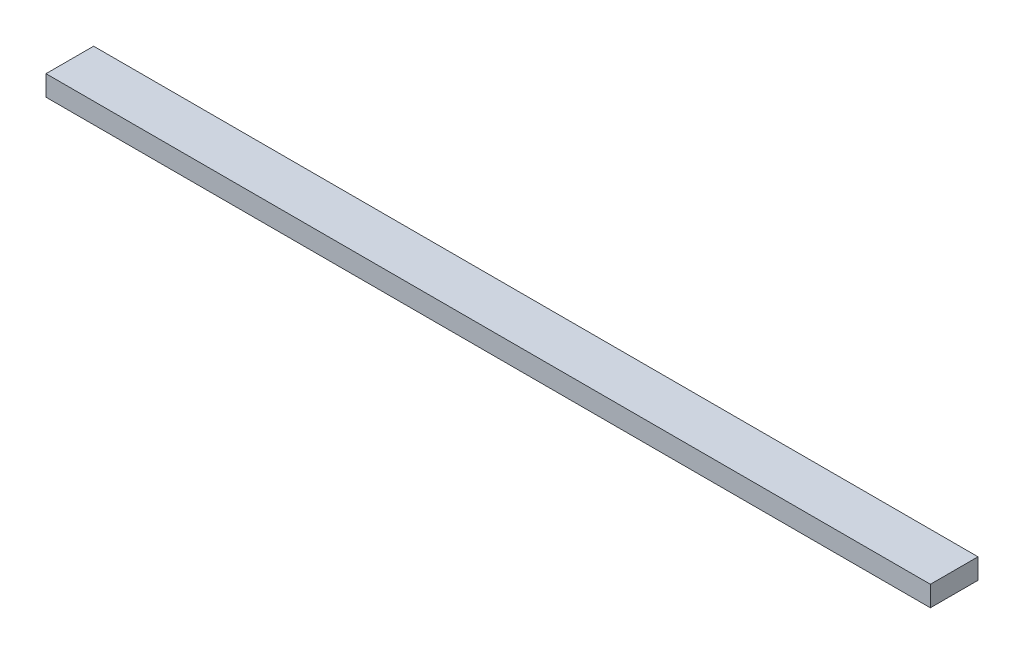
ISO-10303-21;
HEADER;
FILE_DESCRIPTION(('STEP AP214'),'2;1');
FILE_NAME('part.step','',(''),(''),'','','');
FILE_SCHEMA(('AUTOMOTIVE_DESIGN { 1 0 10303 214 1 1 1 1 }'));
ENDSEC;
DATA;
#1=APPLICATION_CONTEXT('core data for automotive mechanical design processes');
#2=APPLICATION_PROTOCOL_DEFINITION('international standard','automotive_design',2000,#1);
#3=PRODUCT_CONTEXT('',#1,'mechanical');
#4=PRODUCT('Part','Part','',(#3));
#5=PRODUCT_RELATED_PRODUCT_CATEGORY('part','',(#4));
#6=PRODUCT_DEFINITION_FORMATION('','',#4);
#7=PRODUCT_DEFINITION_CONTEXT('part definition',#1,'design');
#8=PRODUCT_DEFINITION('design','',#6,#7);
#9=PRODUCT_DEFINITION_SHAPE('','',#8);
#10=(LENGTH_UNIT() NAMED_UNIT(*) SI_UNIT(.MILLI.,.METRE.));
#11=(NAMED_UNIT(*) PLANE_ANGLE_UNIT() SI_UNIT($,.RADIAN.));
#12=(NAMED_UNIT(*) SI_UNIT($,.STERADIAN.) SOLID_ANGLE_UNIT());
#13=UNCERTAINTY_MEASURE_WITH_UNIT(LENGTH_MEASURE(1.E-05),#10,'distance_accuracy_value','');
#14=(GEOMETRIC_REPRESENTATION_CONTEXT(3) GLOBAL_UNCERTAINTY_ASSIGNED_CONTEXT((#13)) GLOBAL_UNIT_ASSIGNED_CONTEXT((#10,
#11,#12)) REPRESENTATION_CONTEXT('',''));
#15=CARTESIAN_POINT('',(0.,0.,0.));
#16=DIRECTION('',(0.,0.,1.));
#17=DIRECTION('',(1.,0.,0.));
#18=AXIS2_PLACEMENT_3D('',#15,#16,#17);
#19=CARTESIAN_POINT('',(0.,0.,0.));
#20=DIRECTION('',(1.,0.,0.));
#21=DIRECTION('',(0.,0.,-1.));
#22=AXIS2_PLACEMENT_3D('',#19,#20,#21);
#23=PLANE('',#22);
#24=DIRECTION('',(0.,-1.,0.));
#25=VECTOR('',#24,1.);
#26=CARTESIAN_POINT('',(0.,-19.05,44.45));
#27=LINE('',#26,#25);
#28=CARTESIAN_POINT('',(0.,19.05,44.45));
#29=VERTEX_POINT('',#28);
#30=CARTESIAN_POINT('',(0.,-19.05,44.45));
#31=VERTEX_POINT('',#30);
#32=EDGE_CURVE('E93',#29,#31,#27,.T.);
#33=ORIENTED_EDGE('',*,*,#32,.F.);
#34=DIRECTION('',(0.,0.,1.));
#35=VECTOR('',#34,1.);
#36=CARTESIAN_POINT('',(0.,19.05,-44.45));
#37=LINE('',#36,#35);
#38=CARTESIAN_POINT('',(0.,19.05,-44.45));
#39=VERTEX_POINT('',#38);
#40=EDGE_CURVE('E109',#39,#29,#37,.T.);
#41=ORIENTED_EDGE('',*,*,#40,.F.);
#42=DIRECTION('',(0.,1.,0.));
#43=VECTOR('',#42,1.);
#44=CARTESIAN_POINT('',(0.,-19.05,-44.45));
#45=LINE('',#44,#43);
#46=CARTESIAN_POINT('',(0.,-19.05,-44.45));
#47=VERTEX_POINT('',#46);
#48=EDGE_CURVE('E95',#47,#39,#45,.T.);
#49=ORIENTED_EDGE('',*,*,#48,.F.);
#50=DIRECTION('',(0.,0.,-1.));
#51=VECTOR('',#50,1.);
#52=CARTESIAN_POINT('',(0.,-19.05,-44.45));
#53=LINE('',#52,#51);
#54=EDGE_CURVE('E83',#31,#47,#53,.T.);
#55=ORIENTED_EDGE('',*,*,#54,.F.);
#56=EDGE_LOOP('',(#33,#41,#49,#55));
#57=FACE_BOUND('',#56,.T.);
#58=ADVANCED_FACE('F41',(#57),#23,.F.);
#59=CARTESIAN_POINT('',(1747.72031844447,19.05,-44.45));
#60=DIRECTION('',(0.,-1.,0.));
#61=DIRECTION('',(0.,0.,-1.));
#62=AXIS2_PLACEMENT_3D('',#59,#60,#61);
#63=PLANE('',#62);
#64=DIRECTION('',(-1.,0.,0.));
#65=VECTOR('',#64,1.);
#66=CARTESIAN_POINT('',(1747.72031844447,19.05,44.45));
#67=LINE('',#66,#65);
#68=CARTESIAN_POINT('',(1651.,19.05,44.45));
#69=VERTEX_POINT('',#68);
#70=EDGE_CURVE('E99',#69,#29,#67,.T.);
#71=ORIENTED_EDGE('',*,*,#70,.F.);
#72=DIRECTION('',(0.,0.,-1.));
#73=VECTOR('',#72,1.);
#74=CARTESIAN_POINT('',(1651.,19.05,-44.45));
#75=LINE('',#74,#73);
#76=CARTESIAN_POINT('',(1651.,19.05,-44.45));
#77=VERTEX_POINT('',#76);
#78=EDGE_CURVE('E57',#69,#77,#75,.T.);
#79=ORIENTED_EDGE('',*,*,#78,.T.);
#80=DIRECTION('',(-1.,0.,0.));
#81=VECTOR('',#80,1.);
#82=CARTESIAN_POINT('',(1747.72031844447,19.05,-44.45));
#83=LINE('',#82,#81);
#84=EDGE_CURVE('E114',#77,#39,#83,.T.);
#85=ORIENTED_EDGE('',*,*,#84,.T.);
#86=ORIENTED_EDGE('',*,*,#40,.T.);
#87=EDGE_LOOP('',(#71,#79,#85,#86));
#88=FACE_BOUND('',#87,.T.);
#89=ADVANCED_FACE('F136',(#88),#63,.F.);
#90=CARTESIAN_POINT('',(1747.72031844447,-19.05,-44.45));
#91=DIRECTION('',(0.,0.,1.));
#92=DIRECTION('',(1.,0.,0.));
#93=AXIS2_PLACEMENT_3D('',#90,#91,#92);
#94=PLANE('',#93);
#95=ORIENTED_EDGE('',*,*,#84,.F.);
#96=DIRECTION('',(0.,-1.,0.));
#97=VECTOR('',#96,1.);
#98=CARTESIAN_POINT('',(1651.,-19.05,-44.45));
#99=LINE('',#98,#97);
#100=CARTESIAN_POINT('',(1651.,-19.05,-44.45));
#101=VERTEX_POINT('',#100);
#102=EDGE_CURVE('E105',#77,#101,#99,.T.);
#103=ORIENTED_EDGE('',*,*,#102,.T.);
#104=DIRECTION('',(-1.,0.,0.));
#105=VECTOR('',#104,1.);
#106=CARTESIAN_POINT('',(1747.72031844447,-19.05,-44.45));
#107=LINE('',#106,#105);
#108=EDGE_CURVE('E88',#101,#47,#107,.T.);
#109=ORIENTED_EDGE('',*,*,#108,.T.);
#110=ORIENTED_EDGE('',*,*,#48,.T.);
#111=EDGE_LOOP('',(#95,#103,#109,#110));
#112=FACE_BOUND('',#111,.T.);
#113=ADVANCED_FACE('F127',(#112),#94,.F.);
#114=CARTESIAN_POINT('',(1747.72031844447,-19.05,-44.45));
#115=DIRECTION('',(0.,1.,0.));
#116=DIRECTION('',(0.,0.,1.));
#117=AXIS2_PLACEMENT_3D('',#114,#115,#116);
#118=PLANE('',#117);
#119=ORIENTED_EDGE('',*,*,#108,.F.);
#120=DIRECTION('',(0.,0.,1.));
#121=VECTOR('',#120,1.);
#122=CARTESIAN_POINT('',(1651.,-19.05,-44.45));
#123=LINE('',#122,#121);
#124=CARTESIAN_POINT('',(1651.,-19.05,44.45));
#125=VERTEX_POINT('',#124);
#126=EDGE_CURVE('E50',#101,#125,#123,.T.);
#127=ORIENTED_EDGE('',*,*,#126,.T.);
#128=DIRECTION('',(-1.,0.,0.));
#129=VECTOR('',#128,1.);
#130=CARTESIAN_POINT('',(1747.72031844447,-19.05,44.45));
#131=LINE('',#130,#129);
#132=EDGE_CURVE('E79',#125,#31,#131,.T.);
#133=ORIENTED_EDGE('',*,*,#132,.T.);
#134=ORIENTED_EDGE('',*,*,#54,.T.);
#135=EDGE_LOOP('',(#119,#127,#133,#134));
#136=FACE_BOUND('',#135,.T.);
#137=ADVANCED_FACE('F82',(#136),#118,.F.);
#138=CARTESIAN_POINT('',(1747.72031844447,-19.05,44.45));
#139=DIRECTION('',(0.,0.,-1.));
#140=DIRECTION('',(-1.,0.,0.));
#141=AXIS2_PLACEMENT_3D('',#138,#139,#140);
#142=PLANE('',#141);
#143=ORIENTED_EDGE('',*,*,#132,.F.);
#144=DIRECTION('',(0.,1.,0.));
#145=VECTOR('',#144,1.);
#146=CARTESIAN_POINT('',(1651.,-19.05,44.45));
#147=LINE('',#146,#145);
#148=EDGE_CURVE('E11',#125,#69,#147,.T.);
#149=ORIENTED_EDGE('',*,*,#148,.T.);
#150=ORIENTED_EDGE('',*,*,#70,.T.);
#151=ORIENTED_EDGE('',*,*,#32,.T.);
#152=EDGE_LOOP('',(#143,#149,#150,#151));
#153=FACE_BOUND('',#152,.T.);
#154=ADVANCED_FACE('F43',(#153),#142,.F.);
#155=CARTESIAN_POINT('',(1651.,19.05,-966.670318444472));
#156=DIRECTION('',(-1.,0.,0.));
#157=DIRECTION('',(0.,0.,1.));
#158=AXIS2_PLACEMENT_3D('',#155,#156,#157);
#159=PLANE('',#158);
#160=ORIENTED_EDGE('',*,*,#78,.F.);
#161=ORIENTED_EDGE('',*,*,#148,.F.);
#162=ORIENTED_EDGE('',*,*,#126,.F.);
#163=ORIENTED_EDGE('',*,*,#102,.F.);
#164=EDGE_LOOP('',(#160,#161,#162,#163));
#165=FACE_BOUND('',#164,.T.);
#166=ADVANCED_FACE('F128',(#165),#159,.F.);
#167=CLOSED_SHELL('',(#58,#89,#113,#137,#154,#166));
#168=MANIFOLD_SOLID_BREP('B2',#167);
#169=ADVANCED_BREP_SHAPE_REPRESENTATION('',(#18,#168),#14);
#170=SHAPE_DEFINITION_REPRESENTATION(#9,#169);
ENDSEC;
END-ISO-10303-21;
